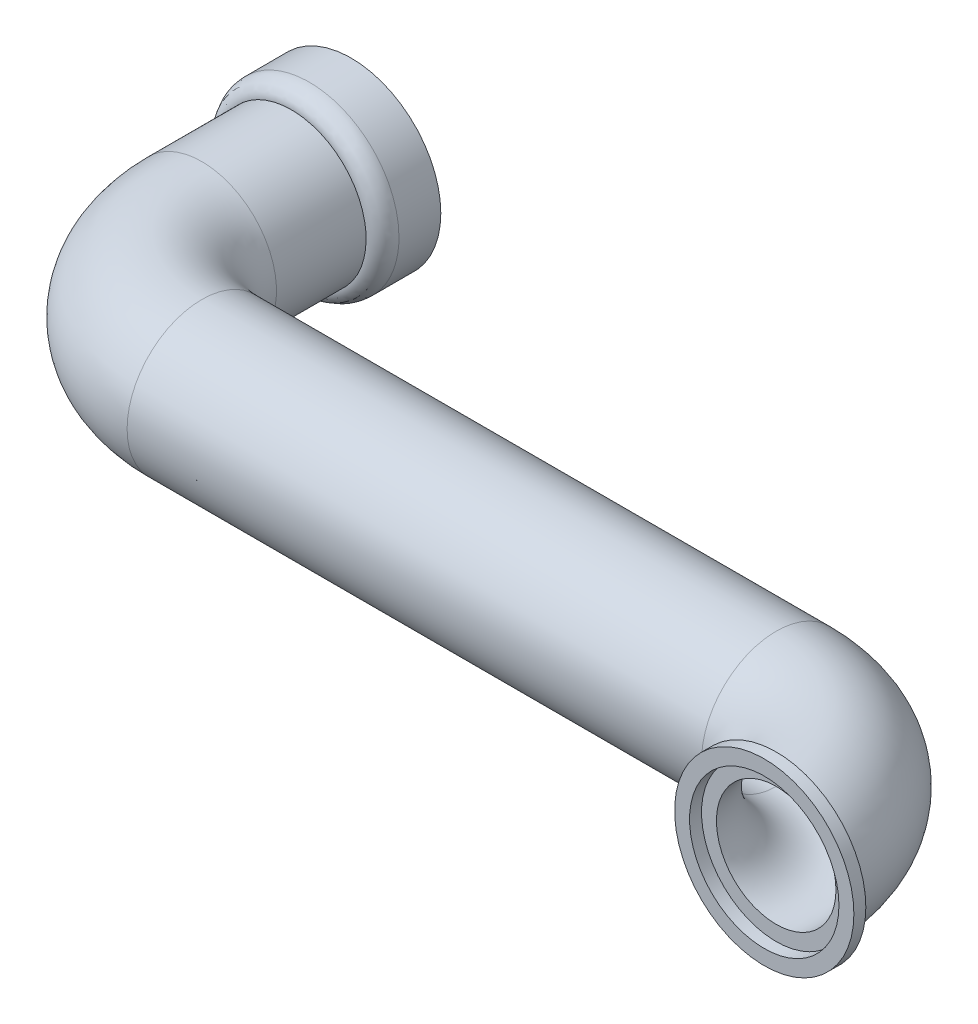
ISO-10303-21;
HEADER;
FILE_DESCRIPTION(('STEP AP214'),'2;1');
FILE_NAME('part.step','',(''),(''),'','','');
FILE_SCHEMA(('AUTOMOTIVE_DESIGN { 1 0 10303 214 1 1 1 1 }'));
ENDSEC;
DATA;
#1=APPLICATION_CONTEXT('core data for automotive mechanical design processes');
#2=APPLICATION_PROTOCOL_DEFINITION('international standard','automotive_design',2000,#1);
#3=PRODUCT_CONTEXT('',#1,'mechanical');
#4=PRODUCT('Part','Part','',(#3));
#5=PRODUCT_RELATED_PRODUCT_CATEGORY('part','',(#4));
#6=PRODUCT_DEFINITION_FORMATION('','',#4);
#7=PRODUCT_DEFINITION_CONTEXT('part definition',#1,'design');
#8=PRODUCT_DEFINITION('design','',#6,#7);
#9=PRODUCT_DEFINITION_SHAPE('','',#8);
#10=(LENGTH_UNIT() NAMED_UNIT(*) SI_UNIT(.MILLI.,.METRE.));
#11=(NAMED_UNIT(*) PLANE_ANGLE_UNIT() SI_UNIT($,.RADIAN.));
#12=(NAMED_UNIT(*) SI_UNIT($,.STERADIAN.) SOLID_ANGLE_UNIT());
#13=UNCERTAINTY_MEASURE_WITH_UNIT(LENGTH_MEASURE(1.E-05),#10,'distance_accuracy_value','');
#14=(GEOMETRIC_REPRESENTATION_CONTEXT(3) GLOBAL_UNCERTAINTY_ASSIGNED_CONTEXT((#13)) GLOBAL_UNIT_ASSIGNED_CONTEXT((#10,
#11,#12)) REPRESENTATION_CONTEXT('',''));
#15=CARTESIAN_POINT('',(0.,0.,0.));
#16=DIRECTION('',(0.,0.,1.));
#17=DIRECTION('',(1.,0.,0.));
#18=AXIS2_PLACEMENT_3D('',#15,#16,#17);
#19=CARTESIAN_POINT('',(136.13,0.,67.));
#20=DIRECTION('',(0.,0.,1.));
#21=DIRECTION('',(1.,0.,0.));
#22=AXIS2_PLACEMENT_3D('',#19,#20,#21);
#23=PLANE('',#22);
#24=CARTESIAN_POINT('',(136.13,0.,67.));
#25=DIRECTION('',(0.,0.,1.));
#26=DIRECTION('',(1.,0.,0.));
#27=AXIS2_PLACEMENT_3D('',#24,#25,#26);
#28=CIRCLE('',#27,15.);
#29=CARTESIAN_POINT('',(151.13,0.,67.));
#30=VERTEX_POINT('',#29);
#31=EDGE_CURVE('E11',#30,#30,#28,.T.);
#32=ORIENTED_EDGE('',*,*,#31,.T.);
#33=EDGE_LOOP('',(#32));
#34=FACE_BOUND('',#33,.T.);
#35=CARTESIAN_POINT('',(136.13,0.,67.));
#36=DIRECTION('',(0.,0.,1.));
#37=DIRECTION('',(1.,0.,0.));
#38=AXIS2_PLACEMENT_3D('',#35,#36,#37);
#39=CIRCLE('',#38,12.5);
#40=CARTESIAN_POINT('',(148.63,0.,67.));
#41=VERTEX_POINT('',#40);
#42=EDGE_CURVE('E59',#41,#41,#39,.T.);
#43=ORIENTED_EDGE('',*,*,#42,.F.);
#44=EDGE_LOOP('',(#43));
#45=FACE_BOUND('',#44,.T.);
#46=ADVANCED_FACE('F48',(#34,#45),#23,.T.);
#47=CARTESIAN_POINT('',(136.13,0.,65.));
#48=DIRECTION('',(0.,0.,1.));
#49=DIRECTION('',(1.,0.,0.));
#50=AXIS2_PLACEMENT_3D('',#47,#48,#49);
#51=PLANE('',#50);
#52=CARTESIAN_POINT('',(136.13,0.,65.));
#53=DIRECTION('',(0.,0.,1.));
#54=DIRECTION('',(1.,0.,0.));
#55=AXIS2_PLACEMENT_3D('',#52,#53,#54);
#56=CIRCLE('',#55,15.);
#57=CARTESIAN_POINT('',(151.13,0.,65.));
#58=VERTEX_POINT('',#57);
#59=EDGE_CURVE('E52',#58,#58,#56,.T.);
#60=ORIENTED_EDGE('',*,*,#59,.F.);
#61=EDGE_LOOP('',(#60));
#62=FACE_BOUND('',#61,.T.);
#63=CARTESIAN_POINT('',(136.13,0.,65.));
#64=DIRECTION('',(0.,0.,1.));
#65=DIRECTION('',(1.,0.,0.));
#66=AXIS2_PLACEMENT_3D('',#63,#64,#65);
#67=CIRCLE('',#66,12.5);
#68=CARTESIAN_POINT('',(148.63,0.,65.));
#69=VERTEX_POINT('',#68);
#70=EDGE_CURVE('E61',#69,#69,#67,.T.);
#71=ORIENTED_EDGE('',*,*,#70,.T.);
#72=EDGE_LOOP('',(#71));
#73=FACE_BOUND('',#72,.T.);
#74=ADVANCED_FACE('F71',(#62,#73),#51,.F.);
#75=CARTESIAN_POINT('',(136.13,0.,67.));
#76=DIRECTION('',(0.,0.,-1.));
#77=DIRECTION('',(-1.,0.,0.));
#78=AXIS2_PLACEMENT_3D('',#75,#76,#77);
#79=CYLINDRICAL_SURFACE('',#78,15.);
#80=ORIENTED_EDGE('',*,*,#31,.F.);
#81=EDGE_LOOP('',(#80));
#82=FACE_BOUND('',#81,.T.);
#83=ORIENTED_EDGE('',*,*,#59,.T.);
#84=EDGE_LOOP('',(#83));
#85=FACE_BOUND('',#84,.T.);
#86=ADVANCED_FACE('F50',(#82,#85),#79,.T.);
#87=CARTESIAN_POINT('',(136.13,0.,67.));
#88=DIRECTION('',(0.,0.,-1.));
#89=DIRECTION('',(-1.,0.,0.));
#90=AXIS2_PLACEMENT_3D('',#87,#88,#89);
#91=CYLINDRICAL_SURFACE('',#90,12.5);
#92=ORIENTED_EDGE('',*,*,#42,.T.);
#93=EDGE_LOOP('',(#92));
#94=FACE_BOUND('',#93,.T.);
#95=ORIENTED_EDGE('',*,*,#70,.F.);
#96=EDGE_LOOP('',(#95));
#97=FACE_BOUND('',#96,.T.);
#98=ADVANCED_FACE('F67',(#94,#97),#91,.F.);
#99=CLOSED_SHELL('',(#46,#74,#86,#98));
#100=MANIFOLD_SOLID_BREP('B2',#99);
#101=CARTESIAN_POINT('',(0.,0.,0.));
#102=DIRECTION('',(0.,0.,1.));
#103=DIRECTION('',(1.,0.,0.));
#104=AXIS2_PLACEMENT_3D('',#101,#102,#103);
#105=PLANE('',#104);
#106=CARTESIAN_POINT('',(0.,0.,0.));
#107=DIRECTION('',(0.,0.,1.));
#108=DIRECTION('',(1.,0.,0.));
#109=AXIS2_PLACEMENT_3D('',#106,#107,#108);
#110=CIRCLE('',#109,15.);
#111=CARTESIAN_POINT('',(15.,0.,0.));
#112=VERTEX_POINT('',#111);
#113=EDGE_CURVE('E133',#112,#112,#110,.T.);
#114=ORIENTED_EDGE('',*,*,#113,.F.);
#115=EDGE_LOOP('',(#114));
#116=FACE_BOUND('',#115,.T.);
#117=CARTESIAN_POINT('',(0.,0.,0.));
#118=DIRECTION('',(0.,0.,1.));
#119=DIRECTION('',(1.,0.,0.));
#120=AXIS2_PLACEMENT_3D('',#117,#118,#119);
#121=CIRCLE('',#120,12.5);
#122=CARTESIAN_POINT('',(12.5,0.,0.));
#123=VERTEX_POINT('',#122);
#124=EDGE_CURVE('E180',#123,#123,#121,.T.);
#125=ORIENTED_EDGE('',*,*,#124,.T.);
#126=EDGE_LOOP('',(#125));
#127=FACE_BOUND('',#126,.T.);
#128=ADVANCED_FACE('F112',(#116,#127),#105,.F.);
#129=CARTESIAN_POINT('',(0.,0.,10.));
#130=DIRECTION('',(0.,0.,-1.));
#131=DIRECTION('',(-1.,0.,0.));
#132=AXIS2_PLACEMENT_3D('',#129,#130,#131);
#133=CYLINDRICAL_SURFACE('',#132,15.);
#134=CARTESIAN_POINT('',(15.,0.,7.));
#135=CARTESIAN_POINT('',(15.,1.96349540639776,7.));
#136=CARTESIAN_POINT('',(14.6095901492237,3.92621826732311,7.));
#137=CARTESIAN_POINT('',(13.1067958261149,7.55428470362958,7.));
#138=CARTESIAN_POINT('',(11.9950026344916,9.21820080110479,7.));
#139=CARTESIAN_POINT('',(9.21820080110479,11.9950026344916,7.));
#140=CARTESIAN_POINT('',(7.55428470362781,13.1067958261157,7.));
#141=CARTESIAN_POINT('',(3.92621826732487,14.609590149223,7.));
#142=CARTESIAN_POINT('',(1.96349540639923,15.,7.));
#143=CARTESIAN_POINT('',(-1.96349540639922,15.,7.));
#144=CARTESIAN_POINT('',(-3.92621826732387,14.6095901492234,7.));
#145=CARTESIAN_POINT('',(-7.55428470362883,13.1067958261152,7.));
#146=CARTESIAN_POINT('',(-9.2182008011046,11.9950026344918,7.));
#147=CARTESIAN_POINT('',(-11.9950026344918,9.21820080110458,7.));
#148=CARTESIAN_POINT('',(-13.1067958261151,7.55428470362905,7.));
#149=CARTESIAN_POINT('',(-14.6095901492235,3.92621826732368,7.));
#150=CARTESIAN_POINT('',(-15.,1.96349540639923,7.));
#151=CARTESIAN_POINT('',(-15.,-1.96349540639922,7.));
#152=CARTESIAN_POINT('',(-14.6095901492235,-3.92621826732364,7.));
#153=CARTESIAN_POINT('',(-13.1067958261152,-7.55428470362901,7.));
#154=CARTESIAN_POINT('',(-11.9950026344911,-9.21820080110531,7.));
#155=CARTESIAN_POINT('',(-9.21820080110529,-11.9950026344911,7.));
#156=CARTESIAN_POINT('',(-7.55428470362903,-13.1067958261151,7.));
#157=CARTESIAN_POINT('',(-3.9262182673237,-14.6095901492234,7.));
#158=CARTESIAN_POINT('',(-1.9634954063992,-15.,7.));
#159=CARTESIAN_POINT('',(1.96349540639925,-15.,7.));
#160=CARTESIAN_POINT('',(3.92621826732487,-14.609590149223,7.));
#161=CARTESIAN_POINT('',(7.55428470362778,-13.1067958261157,7.));
#162=CARTESIAN_POINT('',(9.21820080110465,-11.9950026344918,7.));
#163=CARTESIAN_POINT('',(11.9950026344917,-9.21820080110472,7.));
#164=CARTESIAN_POINT('',(13.1067958261151,-7.55428470362903,7.));
#165=CARTESIAN_POINT('',(14.6095901492234,-3.9262182673237,7.));
#166=CARTESIAN_POINT('',(15.,-1.96349540639777,7.));
#167=CARTESIAN_POINT('',(15.,0.,7.));
#168=(BOUNDED_CURVE() B_SPLINE_CURVE(3,(#134,#135,#136,#137,#138,#139,#140,#141,#142,#143,#144,
#145,#146,#147,#148,#149,#150,#151,#152,#153,#154,#155,#156,#157,#158,#159,#160,#161,#162,#163,
#164,#165,#166,#167),.UNSPECIFIED.,.T.,.F.) B_SPLINE_CURVE_WITH_KNOTS((4,2,2,2,2,2,2,2,2,2,2,2,
2,2,2,2,4),(0.,0.392699081698724,0.785398163397448,1.17809724509617,1.5707963267949,
1.96349540849362,2.35619449019234,2.74889357189107,3.14159265358979,3.53429173528852,
3.92699081698724,4.31968989868597,4.71238898038469,5.10508806208341,5.49778714378214,
5.89048622548086,6.28318530717959),
.UNSPECIFIED.) CURVE() GEOMETRIC_REPRESENTATION_ITEM() RATIONAL_B_SPLINE_CURVE((1.,1.,1.,1.,1.,
1.,1.,1.,1.,1.,1.,1.,1.,1.,1.,1.,1.,1.,1.,1.,1.,1.,1.,1.,1.,1.,1.,1.,1.,1.,1.,1.,1.,1.)) REPRESENTATION_ITEM(''));
#169=CARTESIAN_POINT('',(15.,0.,7.));
#170=VERTEX_POINT('',#169);
#171=EDGE_CURVE('E127',#170,#170,#168,.F.);
#172=ORIENTED_EDGE('',*,*,#171,.T.);
#173=EDGE_LOOP('',(#172));
#174=FACE_BOUND('',#173,.T.);
#175=ORIENTED_EDGE('',*,*,#113,.T.);
#176=EDGE_LOOP('',(#175));
#177=FACE_BOUND('',#176,.T.);
#178=ADVANCED_FACE('F193',(#174,#177),#133,.T.);
#179=CARTESIAN_POINT('',(0.,0.,10.));
#180=DIRECTION('',(0.,0.,-1.));
#181=DIRECTION('',(-1.,0.,0.));
#182=AXIS2_PLACEMENT_3D('',#179,#180,#181);
#183=CYLINDRICAL_SURFACE('',#182,12.5);
#184=CARTESIAN_POINT('',(0.,0.,9.));
#185=DIRECTION('',(0.,0.,-1.));
#186=DIRECTION('',(-1.,0.,0.));
#187=AXIS2_PLACEMENT_3D('',#184,#185,#186);
#188=CIRCLE('',#187,12.5);
#189=CARTESIAN_POINT('',(-12.5,0.,9.));
#190=VERTEX_POINT('',#189);
#191=EDGE_CURVE('E47',#190,#190,#188,.T.);
#192=ORIENTED_EDGE('',*,*,#191,.F.);
#193=EDGE_LOOP('',(#192));
#194=FACE_BOUND('',#193,.T.);
#195=ORIENTED_EDGE('',*,*,#124,.F.);
#196=EDGE_LOOP('',(#195));
#197=FACE_BOUND('',#196,.T.);
#198=ADVANCED_FACE('F202',(#194,#197),#183,.F.);
#199=CARTESIAN_POINT('',(12.5,0.,10.));
#200=CARTESIAN_POINT('',(12.5,1.63624617199814,10.));
#201=CARTESIAN_POINT('',(12.1746584576861,3.27184855610282,10.));
#202=CARTESIAN_POINT('',(10.9223298550961,6.29523725302442,10.));
#203=CARTESIAN_POINT('',(9.99583552874398,7.68183400092113,10.));
#204=CARTESIAN_POINT('',(7.68183400091971,9.99583552874256,10.));
#205=CARTESIAN_POINT('',(6.29523725302337,10.9223298550966,10.));
#206=CARTESIAN_POINT('',(3.27184855610386,12.1746584576856,10.));
#207=CARTESIAN_POINT('',(1.63624617199936,12.5,10.));
#208=CARTESIAN_POINT('',(-1.63624617199935,12.5,10.));
#209=CARTESIAN_POINT('',(-3.27184855610387,12.174658457687,10.));
#210=CARTESIAN_POINT('',(-6.29523725302338,10.9223298550951,10.));
#211=CARTESIAN_POINT('',(-7.68183400091991,9.99583552874237,10.));
#212=CARTESIAN_POINT('',(-9.9958355287438,7.68183400092131,10.));
#213=CARTESIAN_POINT('',(-10.9223298550965,6.2952372530241,10.));
#214=CARTESIAN_POINT('',(-12.1746584576856,3.27184855610318,10.));
#215=CARTESIAN_POINT('',(-12.5,1.63624617199936,10.));
#216=CARTESIAN_POINT('',(-12.5,-1.63624617199935,10.));
#217=CARTESIAN_POINT('',(-12.1746584576856,-3.27184855610314,10.));
#218=CARTESIAN_POINT('',(-10.9223298550966,-6.29523725302407,10.));
#219=CARTESIAN_POINT('',(-9.99583552874378,-7.68183400092132,10.));
#220=CARTESIAN_POINT('',(-7.68183400091989,-9.99583552874238,10.));
#221=CARTESIAN_POINT('',(-6.29523725302398,-10.9223298550959,10.));
#222=CARTESIAN_POINT('',(-3.2718485561033,-12.1746584576862,10.));
#223=CARTESIAN_POINT('',(-1.63624617199934,-12.5,10.));
#224=CARTESIAN_POINT('',(1.63624617199938,-12.5,10.));
#225=CARTESIAN_POINT('',(3.27184855610397,-12.1746584576877,10.));
#226=CARTESIAN_POINT('',(6.29523725302323,-10.9223298550945,10.));
#227=CARTESIAN_POINT('',(7.68183400092197,-9.99583552874456,10.));
#228=CARTESIAN_POINT('',(9.99583552874167,-7.68183400091918,10.));
#229=CARTESIAN_POINT('',(10.9223298550959,-6.29523725302398,10.));
#230=CARTESIAN_POINT('',(12.1746584576862,-3.2718485561033,10.));
#231=CARTESIAN_POINT('',(12.5,-1.63624617199814,10.));
#232=CARTESIAN_POINT('',(12.5,0.,10.));
#233=CARTESIAN_POINT('',(15.,0.,10.));
#234=CARTESIAN_POINT('',(15.0000000000014,1.96349540639776,10.));
#235=CARTESIAN_POINT('',(14.6095901492247,3.92621826732353,10.));
#236=CARTESIAN_POINT('',(13.1067958261139,7.55428470362917,10.));
#237=CARTESIAN_POINT('',(11.9950026344931,9.21820080110621,10.));
#238=CARTESIAN_POINT('',(9.21820080110337,11.9950026344902,10.));
#239=CARTESIAN_POINT('',(7.5542847036279,13.1067958261159,10.));
#240=CARTESIAN_POINT('',(3.92621826732478,14.6095901492227,10.));
#241=CARTESIAN_POINT('',(1.96349540639923,15.,10.));
#242=CARTESIAN_POINT('',(-1.96349540639922,15.,10.));
#243=CARTESIAN_POINT('',(-3.92621826732408,14.6095901492256,9.99999999999858));
#244=CARTESIAN_POINT('',(-7.55428470362862,13.106795826113,10.0000000000014));
#245=CARTESIAN_POINT('',(-9.21820080110389,11.9950026344911,10.));
#246=CARTESIAN_POINT('',(-11.9950026344926,9.21820080110529,10.));
#247=CARTESIAN_POINT('',(-13.1067958261159,7.55428470362935,10.));
#248=CARTESIAN_POINT('',(-14.6095901492227,3.92621826732339,10.));
#249=CARTESIAN_POINT('',(-15.,1.96349540639923,10.));
#250=CARTESIAN_POINT('',(-15.,-1.96349540639922,10.));
#251=CARTESIAN_POINT('',(-14.6095901492228,-3.92621826732335,10.));
#252=CARTESIAN_POINT('',(-13.1067958261159,-7.55428470362931,10.));
#253=CARTESIAN_POINT('',(-11.9950026344925,-9.21820080110672,10.));
#254=CARTESIAN_POINT('',(-9.21820080110387,-11.9950026344897,10.));
#255=CARTESIAN_POINT('',(-7.55428470362948,-13.1067958261145,10.0000000000014));
#256=CARTESIAN_POINT('',(-3.92621826732325,-14.6095901492241,9.99999999999858));
#257=CARTESIAN_POINT('',(-1.9634954063992,-15.,10.));
#258=CARTESIAN_POINT('',(1.96349540639925,-15.,10.));
#259=CARTESIAN_POINT('',(3.92621826732534,-14.6095901492241,10.));
#260=CARTESIAN_POINT('',(7.55428470362731,-13.1067958261145,10.));
#261=CARTESIAN_POINT('',(9.21820080110608,-11.9950026344932,10.));
#262=CARTESIAN_POINT('',(11.9950026344903,-9.2182008011033,10.));
#263=CARTESIAN_POINT('',(13.1067958261145,-7.55428470362948,10.0000000000014));
#264=CARTESIAN_POINT('',(14.6095901492241,-3.92621826732325,9.99999999999858));
#265=CARTESIAN_POINT('',(14.9999999999986,-1.96349540639777,10.));
#266=CARTESIAN_POINT('',(15.,0.,10.));
#267=CARTESIAN_POINT('',(15.,0.,7.));
#268=CARTESIAN_POINT('',(15.,1.96349540639776,7.));
#269=CARTESIAN_POINT('',(14.6095901492237,3.92621826732311,7.));
#270=CARTESIAN_POINT('',(13.1067958261149,7.55428470362958,7.));
#271=CARTESIAN_POINT('',(11.9950026344916,9.21820080110479,7.));
#272=CARTESIAN_POINT('',(9.21820080110479,11.9950026344916,7.));
#273=CARTESIAN_POINT('',(7.55428470362781,13.1067958261157,7.));
#274=CARTESIAN_POINT('',(3.92621826732487,14.609590149223,7.));
#275=CARTESIAN_POINT('',(1.96349540639923,15.,7.));
#276=CARTESIAN_POINT('',(-1.96349540639922,15.,7.));
#277=CARTESIAN_POINT('',(-3.92621826732388,14.6095901492234,7.));
#278=CARTESIAN_POINT('',(-7.55428470362883,13.1067958261152,7.));
#279=CARTESIAN_POINT('',(-9.2182008011046,11.9950026344918,7.));
#280=CARTESIAN_POINT('',(-11.9950026344918,9.21820080110458,7.));
#281=CARTESIAN_POINT('',(-13.1067958261151,7.55428470362905,7.));
#282=CARTESIAN_POINT('',(-14.6095901492235,3.92621826732368,7.));
#283=CARTESIAN_POINT('',(-15.,1.96349540639923,7.));
#284=CARTESIAN_POINT('',(-15.,-1.96349540639922,7.));
#285=CARTESIAN_POINT('',(-14.6095901492235,-3.92621826732364,7.));
#286=CARTESIAN_POINT('',(-13.1067958261152,-7.55428470362901,7.));
#287=CARTESIAN_POINT('',(-11.9950026344911,-9.21820080110531,7.));
#288=CARTESIAN_POINT('',(-9.21820080110529,-11.9950026344911,7.));
#289=CARTESIAN_POINT('',(-7.55428470362903,-13.1067958261151,7.));
#290=CARTESIAN_POINT('',(-3.9262182673237,-14.6095901492234,7.));
#291=CARTESIAN_POINT('',(-1.9634954063992,-15.,7.));
#292=CARTESIAN_POINT('',(1.96349540639925,-15.,7.));
#293=CARTESIAN_POINT('',(3.92621826732487,-14.609590149223,7.));
#294=CARTESIAN_POINT('',(7.55428470362778,-13.1067958261157,7.));
#295=CARTESIAN_POINT('',(9.21820080110465,-11.9950026344918,7.));
#296=CARTESIAN_POINT('',(11.9950026344917,-9.21820080110472,7.));
#297=CARTESIAN_POINT('',(13.1067958261151,-7.55428470362903,7.));
#298=CARTESIAN_POINT('',(14.6095901492234,-3.9262182673237,7.));
#299=CARTESIAN_POINT('',(15.,-1.96349540639777,7.));
#300=CARTESIAN_POINT('',(15.,0.,7.));
#301=(BOUNDED_SURFACE() B_SPLINE_SURFACE(2,3,((#199,#200,#201,#202,#203,#204,#205,#206,#207,
#208,#209,#210,#211,#212,#213,#214,#215,#216,#217,#218,#219,#220,#221,#222,#223,#224,#225,#226,
#227,#228,#229,#230,#231,#232),(#233,#234,#235,#236,#237,#238,#239,#240,#241,#242,#243,#244,
#245,#246,#247,#248,#249,#250,#251,#252,#253,#254,#255,#256,#257,#258,#259,#260,#261,#262,#263,
#264,#265,#266),(#267,#268,#269,#270,#271,#272,#273,#274,#275,#276,#277,#278,#279,#280,#281,
#282,#283,#284,#285,#286,#287,#288,#289,#290,#291,#292,#293,#294,#295,#296,#297,#298,#299,
#300)),.UNSPECIFIED.,.F.,.T.,.F.) B_SPLINE_SURFACE_WITH_KNOTS((3,3),(4,2,2,2,2,2,2,2,2,2,2,2,2,
2,2,2,4),(0.,1.),(0.,0.392699081698724,0.785398163397448,1.17809724509617,1.5707963267949,
1.96349540849362,2.35619449019234,2.74889357189107,3.14159265358979,3.53429173528852,
3.92699081698724,4.31968989868597,4.71238898038469,5.10508806208341,5.49778714378214,
5.89048622548086,6.28318530717959),
.UNSPECIFIED.) GEOMETRIC_REPRESENTATION_ITEM() RATIONAL_B_SPLINE_SURFACE(((1.,1.,1.,1.,1.,1.,1.,
1.,1.,1.,1.,1.,1.,1.,1.,1.,1.,1.,1.,1.,1.,1.,1.,1.,1.,1.,1.,1.,1.,1.,1.,1.,1.,1.),
(0.707106781186547,0.707106781186547,0.707106781186548,0.707106781186548,0.707106781186548,
0.707106781186548,0.707106781186548,0.707106781186548,0.707106781186547,0.707106781186547,
0.707106781186548,0.707106781186548,0.707106781186548,0.707106781186548,0.707106781186548,
0.707106781186548,0.707106781186547,0.707106781186547,0.707106781186548,0.707106781186548,
0.707106781186548,0.707106781186548,0.707106781186548,0.707106781186548,0.707106781186547,
0.707106781186547,0.707106781186548,0.707106781186548,0.707106781186548,0.707106781186548,
0.707106781186548,0.707106781186548,0.707106781186547,0.707106781186547),(1.,1.,1.,1.,1.,1.,1.,
1.,1.,1.,1.,1.,1.,1.,1.,1.,1.,1.,1.,1.,1.,1.,1.,1.,1.,1.,1.,1.,1.,1.,1.,1.,1.,1.))) REPRESENTATION_ITEM('') SURFACE());
#302=CARTESIAN_POINT('',(12.5,0.,10.));
#303=CARTESIAN_POINT('',(12.5,-1.63624617199814,10.));
#304=CARTESIAN_POINT('',(12.1746584576862,-3.2718485561033,10.));
#305=CARTESIAN_POINT('',(10.9223298550959,-6.29523725302398,10.));
#306=CARTESIAN_POINT('',(9.99583552874167,-7.68183400091918,10.));
#307=CARTESIAN_POINT('',(7.68183400092197,-9.99583552874456,10.));
#308=CARTESIAN_POINT('',(6.29523725302323,-10.9223298550945,10.));
#309=CARTESIAN_POINT('',(3.27184855610397,-12.1746584576877,10.));
#310=CARTESIAN_POINT('',(1.63624617199938,-12.5,10.));
#311=CARTESIAN_POINT('',(-1.63624617199934,-12.5,10.));
#312=CARTESIAN_POINT('',(-3.2718485561033,-12.1746584576862,10.));
#313=CARTESIAN_POINT('',(-6.29523725302398,-10.9223298550959,10.));
#314=CARTESIAN_POINT('',(-7.68183400091989,-9.99583552874238,10.));
#315=CARTESIAN_POINT('',(-9.99583552874378,-7.68183400092132,10.));
#316=CARTESIAN_POINT('',(-10.9223298550966,-6.29523725302407,10.));
#317=CARTESIAN_POINT('',(-12.1746584576856,-3.27184855610314,10.));
#318=CARTESIAN_POINT('',(-12.5,-1.63624617199935,10.));
#319=CARTESIAN_POINT('',(-12.5,1.63624617199936,10.));
#320=CARTESIAN_POINT('',(-12.1746584576856,3.27184855610318,10.));
#321=CARTESIAN_POINT('',(-10.9223298550965,6.2952372530241,10.));
#322=CARTESIAN_POINT('',(-9.9958355287438,7.68183400092131,10.));
#323=CARTESIAN_POINT('',(-7.68183400091991,9.99583552874237,10.));
#324=CARTESIAN_POINT('',(-6.29523725302338,10.9223298550951,10.));
#325=CARTESIAN_POINT('',(-3.27184855610387,12.174658457687,10.));
#326=CARTESIAN_POINT('',(-1.63624617199935,12.5,10.));
#327=CARTESIAN_POINT('',(1.63624617199936,12.5,10.));
#328=CARTESIAN_POINT('',(3.27184855610386,12.1746584576856,10.));
#329=CARTESIAN_POINT('',(6.29523725302337,10.9223298550966,10.));
#330=CARTESIAN_POINT('',(7.68183400091971,9.99583552874256,10.));
#331=CARTESIAN_POINT('',(9.99583552874398,7.68183400092113,10.));
#332=CARTESIAN_POINT('',(10.9223298550961,6.29523725302442,10.));
#333=CARTESIAN_POINT('',(12.1746584576861,3.27184855610282,10.));
#334=CARTESIAN_POINT('',(12.5,1.63624617199814,10.));
#335=CARTESIAN_POINT('',(12.5,0.,10.));
#336=(BOUNDED_CURVE() B_SPLINE_CURVE(3,(#302,#303,#304,#305,#306,#307,#308,#309,#310,#311,#312,
#313,#314,#315,#316,#317,#318,#319,#320,#321,#322,#323,#324,#325,#326,#327,#328,#329,#330,#331,
#332,#333,#334,#335),.UNSPECIFIED.,.T.,.F.) B_SPLINE_CURVE_WITH_KNOTS((4,2,2,2,2,2,2,2,2,2,2,2,
2,2,2,2,4),(0.,0.392699081698725,0.785398163397448,1.17809724509617,1.5707963267949,
1.96349540849362,2.35619449019234,2.74889357189107,3.14159265358979,3.53429173528852,
3.92699081698724,4.31968989868597,4.71238898038469,5.10508806208341,5.49778714378214,
5.89048622548086,6.28318530717959),
.UNSPECIFIED.) CURVE() GEOMETRIC_REPRESENTATION_ITEM() RATIONAL_B_SPLINE_CURVE((1.,1.,1.,1.,1.,
1.,1.,1.,1.,1.,1.,1.,1.,1.,1.,1.,1.,1.,1.,1.,1.,1.,1.,1.,1.,1.,1.,1.,1.,1.,1.,1.,1.,1.)) REPRESENTATION_ITEM(''));
#337=CARTESIAN_POINT('',(12.5,0.,10.));
#338=VERTEX_POINT('',#337);
#339=EDGE_CURVE('E141',#338,#338,#336,.F.);
#340=ORIENTED_EDGE('',*,*,#171,.F.);
#341=EDGE_LOOP('',(#340));
#342=FACE_BOUND('',#341,.T.);
#343=ORIENTED_EDGE('',*,*,#339,.F.);
#344=EDGE_LOOP('',(#343));
#345=FACE_BOUND('',#344,.T.);
#346=ADVANCED_FACE('F115',(#342,#345),#301,.T.);
#347=CARTESIAN_POINT('',(0.,0.,9.));
#348=DIRECTION('',(0.,0.,-1.));
#349=DIRECTION('',(-1.,0.,0.));
#350=AXIS2_PLACEMENT_3D('',#347,#348,#349);
#351=PLANE('',#350);
#352=ORIENTED_EDGE('',*,*,#191,.T.);
#353=EDGE_LOOP('',(#352));
#354=FACE_BOUND('',#353,.T.);
#355=CARTESIAN_POINT('',(0.,0.,9.));
#356=DIRECTION('',(0.,0.,-1.));
#357=DIRECTION('',(-1.,0.,0.));
#358=AXIS2_PLACEMENT_3D('',#355,#356,#357);
#359=CIRCLE('',#358,10.);
#360=CARTESIAN_POINT('',(-10.,0.,9.));
#361=VERTEX_POINT('',#360);
#362=EDGE_CURVE('E151',#361,#361,#359,.T.);
#363=ORIENTED_EDGE('',*,*,#362,.F.);
#364=EDGE_LOOP('',(#363));
#365=FACE_BOUND('',#364,.T.);
#366=ADVANCED_FACE('F209',(#354,#365),#351,.T.);
#367=CARTESIAN_POINT('',(0.,0.,9.));
#368=DIRECTION('',(0.,0.,1.));
#369=DIRECTION('',(1.,0.,0.));
#370=AXIS2_PLACEMENT_3D('',#367,#368,#369);
#371=CYLINDRICAL_SURFACE('',#370,10.);
#372=ORIENTED_EDGE('',*,*,#362,.T.);
#373=EDGE_LOOP('',(#372));
#374=FACE_BOUND('',#373,.T.);
#375=CARTESIAN_POINT('',(0.,0.,25.));
#376=DIRECTION('',(0.,0.,1.));
#377=DIRECTION('',(1.,0.,0.));
#378=AXIS2_PLACEMENT_3D('',#375,#376,#377);
#379=CIRCLE('',#378,10.);
#380=CARTESIAN_POINT('',(-9.99999999999999,0.,25.));
#381=VERTEX_POINT('',#380);
#382=EDGE_CURVE('E168',#381,#381,#379,.F.);
#383=ORIENTED_EDGE('',*,*,#382,.F.);
#384=EDGE_LOOP('',(#383));
#385=FACE_BOUND('',#384,.T.);
#386=ADVANCED_FACE('F212',(#374,#385),#371,.F.);
#387=CARTESIAN_POINT('',(0.,0.,25.));
#388=DIRECTION('',(0.,0.,-1.));
#389=DIRECTION('',(-1.,0.,0.));
#390=AXIS2_PLACEMENT_3D('',#387,#388,#389);
#391=CYLINDRICAL_SURFACE('',#390,12.5);
#392=CARTESIAN_POINT('',(0.,0.,25.));
#393=DIRECTION('',(0.,0.,1.));
#394=DIRECTION('',(1.,0.,0.));
#395=AXIS2_PLACEMENT_3D('',#392,#393,#394);
#396=CIRCLE('',#395,12.5);
#397=CARTESIAN_POINT('',(-12.5,0.,25.));
#398=VERTEX_POINT('',#397);
#399=EDGE_CURVE('E146',#398,#398,#396,.T.);
#400=ORIENTED_EDGE('',*,*,#399,.F.);
#401=EDGE_LOOP('',(#400));
#402=FACE_BOUND('',#401,.T.);
#403=ORIENTED_EDGE('',*,*,#339,.T.);
#404=EDGE_LOOP('',(#403));
#405=FACE_BOUND('',#404,.T.);
#406=ADVANCED_FACE('F142',(#402,#405),#391,.T.);
#407=CARTESIAN_POINT('',(20.,0.,25.));
#408=DIRECTION('',(0.,1.,0.));
#409=DIRECTION('',(0.,0.,1.));
#410=AXIS2_PLACEMENT_3D('',#407,#408,#409);
#411=TOROIDAL_SURFACE('',#410,20.,12.5);
#412=CARTESIAN_POINT('',(20.0000000000001,0.,45.));
#413=DIRECTION('',(1.,0.,0.));
#414=DIRECTION('',(0.,0.,-1.));
#415=AXIS2_PLACEMENT_3D('',#412,#413,#414);
#416=CIRCLE('',#415,12.5);
#417=CARTESIAN_POINT('',(20.0000000000001,0.,57.5));
#418=VERTEX_POINT('',#417);
#419=EDGE_CURVE('E170',#418,#418,#416,.T.);
#420=CARTESIAN_POINT('',(20.,0.,25.));
#421=DIRECTION('',(0.,1.,0.));
#422=DIRECTION('',(0.,0.,1.));
#423=AXIS2_PLACEMENT_3D('',#420,#421,#422);
#424=CIRCLE('',#423,32.5);
#425=EDGE_CURVE('',#398,#418,#424,.T.);
#426=ORIENTED_EDGE('',*,*,#399,.T.);
#427=ORIENTED_EDGE('',*,*,#419,.F.);
#428=ORIENTED_EDGE('',*,*,#425,.T.);
#429=ORIENTED_EDGE('',*,*,#425,.F.);
#430=EDGE_LOOP('',(#426,#428,#427,#429));
#431=FACE_BOUND('',#430,.T.);
#432=ADVANCED_FACE('F218',(#431),#411,.T.);
#433=CARTESIAN_POINT('',(20.0000000000001,0.,45.));
#434=DIRECTION('',(1.,0.,0.));
#435=DIRECTION('',(0.,0.,-1.));
#436=AXIS2_PLACEMENT_3D('',#433,#434,#435);
#437=CYLINDRICAL_SURFACE('',#436,12.5);
#438=CARTESIAN_POINT('',(116.13,0.,45.));
#439=DIRECTION('',(1.,0.,0.));
#440=DIRECTION('',(0.,0.,-1.));
#441=AXIS2_PLACEMENT_3D('',#438,#439,#440);
#442=CIRCLE('',#441,12.5);
#443=CARTESIAN_POINT('',(116.13,0.,32.5));
#444=VERTEX_POINT('',#443);
#445=EDGE_CURVE('E169',#444,#444,#442,.T.);
#446=ORIENTED_EDGE('',*,*,#445,.F.);
#447=EDGE_LOOP('',(#446));
#448=FACE_BOUND('',#447,.T.);
#449=ORIENTED_EDGE('',*,*,#419,.T.);
#450=EDGE_LOOP('',(#449));
#451=FACE_BOUND('',#450,.T.);
#452=ADVANCED_FACE('F225',(#448,#451),#437,.T.);
#453=CARTESIAN_POINT('',(116.13,0.,65.0000000000003));
#454=DIRECTION('',(0.,-1.,0.));
#455=DIRECTION('',(0.,0.,-1.));
#456=AXIS2_PLACEMENT_3D('',#453,#454,#455);
#457=TOROIDAL_SURFACE('',#456,20.0000000000003,12.5);
#458=CARTESIAN_POINT('',(136.13,0.,65.));
#459=DIRECTION('',(0.,0.,1.));
#460=DIRECTION('',(1.,0.,0.));
#461=AXIS2_PLACEMENT_3D('',#458,#459,#460);
#462=CIRCLE('',#461,12.5);
#463=CARTESIAN_POINT('',(148.63,0.,64.9999999999998));
#464=VERTEX_POINT('',#463);
#465=EDGE_CURVE('E164',#464,#464,#462,.T.);
#466=CARTESIAN_POINT('',(116.13,0.,65.0000000000003));
#467=DIRECTION('',(0.,-1.,0.));
#468=DIRECTION('',(0.,0.,-1.));
#469=AXIS2_PLACEMENT_3D('',#466,#467,#468);
#470=CIRCLE('',#469,32.5000000000003);
#471=EDGE_CURVE('',#444,#464,#470,.T.);
#472=ORIENTED_EDGE('',*,*,#445,.T.);
#473=ORIENTED_EDGE('',*,*,#465,.F.);
#474=ORIENTED_EDGE('',*,*,#471,.T.);
#475=ORIENTED_EDGE('',*,*,#471,.F.);
#476=EDGE_LOOP('',(#472,#474,#473,#475));
#477=FACE_BOUND('',#476,.T.);
#478=ADVANCED_FACE('F221',(#477),#457,.T.);
#479=CARTESIAN_POINT('',(136.13,0.,65.));
#480=DIRECTION('',(0.,0.,1.));
#481=DIRECTION('',(1.,0.,0.));
#482=AXIS2_PLACEMENT_3D('',#479,#480,#481);
#483=PLANE('',#482);
#484=CARTESIAN_POINT('',(136.13,0.,65.));
#485=DIRECTION('',(0.,0.,1.));
#486=DIRECTION('',(1.,0.,0.));
#487=AXIS2_PLACEMENT_3D('',#484,#485,#486);
#488=CIRCLE('',#487,10.);
#489=CARTESIAN_POINT('',(146.13,0.,64.9999999999998));
#490=VERTEX_POINT('',#489);
#491=EDGE_CURVE('E147',#490,#490,#488,.F.);
#492=ORIENTED_EDGE('',*,*,#491,.T.);
#493=EDGE_LOOP('',(#492));
#494=FACE_BOUND('',#493,.T.);
#495=ORIENTED_EDGE('',*,*,#465,.T.);
#496=EDGE_LOOP('',(#495));
#497=FACE_BOUND('',#496,.T.);
#498=ADVANCED_FACE('F224',(#494,#497),#483,.T.);
#499=CARTESIAN_POINT('',(20.,0.,25.));
#500=DIRECTION('',(0.,1.,0.));
#501=DIRECTION('',(0.,0.,1.));
#502=AXIS2_PLACEMENT_3D('',#499,#500,#501);
#503=TOROIDAL_SURFACE('',#502,20.,10.);
#504=CARTESIAN_POINT('',(20.0000000000001,0.,45.));
#505=DIRECTION('',(1.,0.,0.));
#506=DIRECTION('',(0.,0.,-1.));
#507=AXIS2_PLACEMENT_3D('',#504,#505,#506);
#508=CIRCLE('',#507,10.);
#509=CARTESIAN_POINT('',(20.0000000000001,0.,55.));
#510=VERTEX_POINT('',#509);
#511=EDGE_CURVE('E160',#510,#510,#508,.F.);
#512=CARTESIAN_POINT('',(20.,0.,25.));
#513=DIRECTION('',(0.,1.,0.));
#514=DIRECTION('',(0.,0.,1.));
#515=AXIS2_PLACEMENT_3D('',#512,#513,#514);
#516=CIRCLE('',#515,30.);
#517=EDGE_CURVE('',#381,#510,#516,.T.);
#518=ORIENTED_EDGE('',*,*,#382,.T.);
#519=ORIENTED_EDGE('',*,*,#511,.F.);
#520=ORIENTED_EDGE('',*,*,#517,.T.);
#521=ORIENTED_EDGE('',*,*,#517,.F.);
#522=EDGE_LOOP('',(#518,#520,#519,#521));
#523=FACE_BOUND('',#522,.T.);
#524=ADVANCED_FACE('F235',(#523),#503,.F.);
#525=CARTESIAN_POINT('',(20.0000000000001,0.,45.));
#526=DIRECTION('',(1.,0.,0.));
#527=DIRECTION('',(0.,0.,-1.));
#528=AXIS2_PLACEMENT_3D('',#525,#526,#527);
#529=CYLINDRICAL_SURFACE('',#528,10.);
#530=CARTESIAN_POINT('',(116.13,0.,45.));
#531=DIRECTION('',(1.,0.,0.));
#532=DIRECTION('',(0.,0.,-1.));
#533=AXIS2_PLACEMENT_3D('',#530,#531,#532);
#534=CIRCLE('',#533,10.);
#535=CARTESIAN_POINT('',(116.13,0.,35.));
#536=VERTEX_POINT('',#535);
#537=EDGE_CURVE('E154',#536,#536,#534,.F.);
#538=ORIENTED_EDGE('',*,*,#537,.F.);
#539=EDGE_LOOP('',(#538));
#540=FACE_BOUND('',#539,.T.);
#541=ORIENTED_EDGE('',*,*,#511,.T.);
#542=EDGE_LOOP('',(#541));
#543=FACE_BOUND('',#542,.T.);
#544=ADVANCED_FACE('F238',(#540,#543),#529,.F.);
#545=CARTESIAN_POINT('',(116.13,0.,65.0000000000003));
#546=DIRECTION('',(0.,-1.,0.));
#547=DIRECTION('',(0.,0.,-1.));
#548=AXIS2_PLACEMENT_3D('',#545,#546,#547);
#549=TOROIDAL_SURFACE('',#548,20.0000000000003,10.);
#550=CARTESIAN_POINT('',(116.13,0.,65.0000000000003));
#551=DIRECTION('',(0.,-1.,0.));
#552=DIRECTION('',(0.,0.,-1.));
#553=AXIS2_PLACEMENT_3D('',#550,#551,#552);
#554=CIRCLE('',#553,30.0000000000003);
#555=EDGE_CURVE('',#536,#490,#554,.T.);
#556=ORIENTED_EDGE('',*,*,#537,.T.);
#557=ORIENTED_EDGE('',*,*,#491,.F.);
#558=ORIENTED_EDGE('',*,*,#555,.T.);
#559=ORIENTED_EDGE('',*,*,#555,.F.);
#560=EDGE_LOOP('',(#556,#558,#557,#559));
#561=FACE_BOUND('',#560,.T.);
#562=ADVANCED_FACE('F220',(#561),#549,.F.);
#563=CLOSED_SHELL('',(#128,#178,#198,#346,#366,#386,#406,#432,#452,#478,#498,#524,#544,#562));
#564=MANIFOLD_SOLID_BREP('B6',#563);
#565=ADVANCED_BREP_SHAPE_REPRESENTATION('',(#18,#100,#564),#14);
#566=SHAPE_DEFINITION_REPRESENTATION(#9,#565);
ENDSEC;
END-ISO-10303-21;
